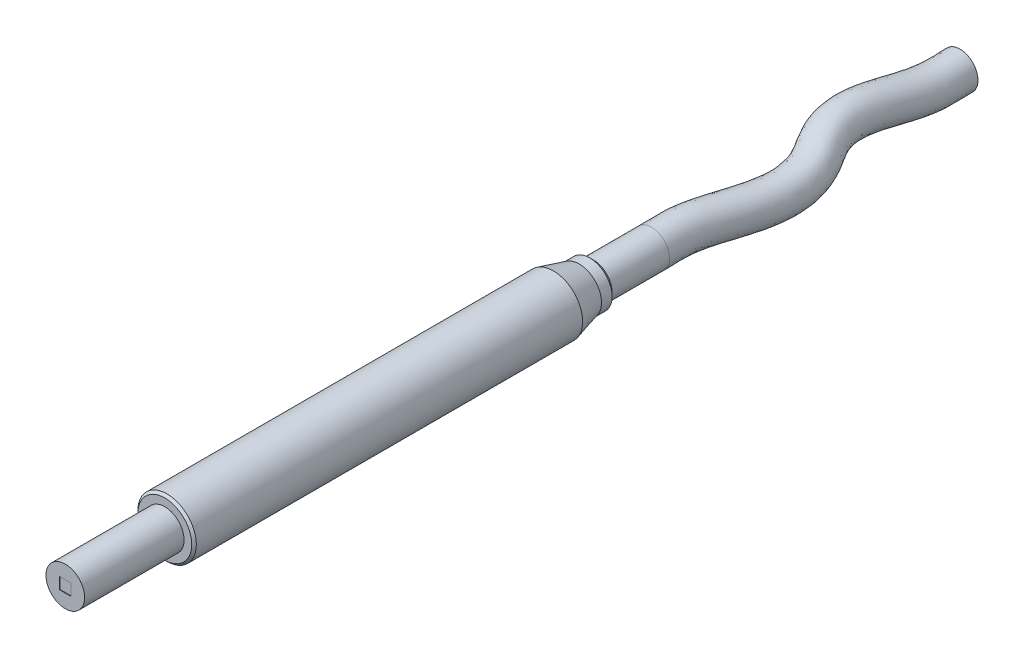
ISO-10303-21;
HEADER;
FILE_DESCRIPTION(('STEP AP214'),'2;1');
FILE_NAME('part.step','',(''),(''),'','','');
FILE_SCHEMA(('AUTOMOTIVE_DESIGN { 1 0 10303 214 1 1 1 1 }'));
ENDSEC;
DATA;
#1=APPLICATION_CONTEXT('core data for automotive mechanical design processes');
#2=APPLICATION_PROTOCOL_DEFINITION('international standard','automotive_design',2000,#1);
#3=PRODUCT_CONTEXT('',#1,'mechanical');
#4=PRODUCT('Part','Part','',(#3));
#5=PRODUCT_RELATED_PRODUCT_CATEGORY('part','',(#4));
#6=PRODUCT_DEFINITION_FORMATION('','',#4);
#7=PRODUCT_DEFINITION_CONTEXT('part definition',#1,'design');
#8=PRODUCT_DEFINITION('design','',#6,#7);
#9=PRODUCT_DEFINITION_SHAPE('','',#8);
#10=(LENGTH_UNIT() NAMED_UNIT(*) SI_UNIT(.MILLI.,.METRE.));
#11=(NAMED_UNIT(*) PLANE_ANGLE_UNIT() SI_UNIT($,.RADIAN.));
#12=(NAMED_UNIT(*) SI_UNIT($,.STERADIAN.) SOLID_ANGLE_UNIT());
#13=UNCERTAINTY_MEASURE_WITH_UNIT(LENGTH_MEASURE(1.E-05),#10,'distance_accuracy_value','');
#14=(GEOMETRIC_REPRESENTATION_CONTEXT(3) GLOBAL_UNCERTAINTY_ASSIGNED_CONTEXT((#13)) GLOBAL_UNIT_ASSIGNED_CONTEXT((#10,
#11,#12)) REPRESENTATION_CONTEXT('',''));
#15=CARTESIAN_POINT('',(0.,0.,0.));
#16=DIRECTION('',(0.,0.,1.));
#17=DIRECTION('',(1.,0.,0.));
#18=AXIS2_PLACEMENT_3D('',#15,#16,#17);
#19=CARTESIAN_POINT('',(0.,0.,-127.3));
#20=DIRECTION('',(0.,0.,1.));
#21=DIRECTION('',(1.,0.,0.));
#22=AXIS2_PLACEMENT_3D('',#19,#20,#21);
#23=CYLINDRICAL_SURFACE('',#22,4.85499999999988);
#24=CARTESIAN_POINT('',(0.,0.,-113.9));
#25=DIRECTION('',(0.,0.,-1.));
#26=DIRECTION('',(-1.,0.,0.));
#27=AXIS2_PLACEMENT_3D('',#24,#25,#26);
#28=CIRCLE('',#27,4.85499999999988);
#29=CARTESIAN_POINT('',(-4.85499999999988,0.,-113.9));
#30=VERTEX_POINT('',#29);
#31=EDGE_CURVE('E11',#30,#30,#28,.F.);
#32=ORIENTED_EDGE('',*,*,#31,.T.);
#33=EDGE_LOOP('',(#32));
#34=FACE_BOUND('',#33,.T.);
#35=CARTESIAN_POINT('',(0.,0.,-111.6));
#36=DIRECTION('',(0.,0.,-1.));
#37=DIRECTION('',(-1.,0.,0.));
#38=AXIS2_PLACEMENT_3D('',#35,#36,#37);
#39=CIRCLE('',#38,4.85499999999988);
#40=CARTESIAN_POINT('',(-4.85499999999988,0.,-111.6));
#41=VERTEX_POINT('',#40);
#42=EDGE_CURVE('E123',#41,#41,#39,.T.);
#43=ORIENTED_EDGE('',*,*,#42,.T.);
#44=EDGE_LOOP('',(#43));
#45=FACE_BOUND('',#44,.T.);
#46=ADVANCED_FACE('F34',(#34,#45),#23,.T.);
#47=CARTESIAN_POINT('',(0.,0.,-21.6));
#48=DIRECTION('',(0.,0.,1.));
#49=DIRECTION('',(1.,0.,0.));
#50=AXIS2_PLACEMENT_3D('',#47,#48,#49);
#51=CYLINDRICAL_SURFACE('',#50,4.2);
#52=CARTESIAN_POINT('',(0.,0.,-21.6));
#53=DIRECTION('',(0.,0.,1.));
#54=DIRECTION('',(1.,0.,0.));
#55=AXIS2_PLACEMENT_3D('',#52,#53,#54);
#56=CIRCLE('',#55,4.2);
#57=CARTESIAN_POINT('',(4.2,0.,-21.6));
#58=VERTEX_POINT('',#57);
#59=EDGE_CURVE('E112',#58,#58,#56,.T.);
#60=CARTESIAN_POINT('',(0.,0.,0.));
#61=DIRECTION('',(0.,0.,1.));
#62=DIRECTION('',(1.,0.,0.));
#63=AXIS2_PLACEMENT_3D('',#60,#61,#62);
#64=CIRCLE('',#63,4.2);
#65=CARTESIAN_POINT('',(4.2,0.,0.));
#66=VERTEX_POINT('',#65);
#67=EDGE_CURVE('E120',#66,#66,#64,.T.);
#68=CARTESIAN_POINT('',(4.2,0.,-21.6));
#69=CARTESIAN_POINT('',(4.2,0.,-21.375));
#70=CARTESIAN_POINT('',(4.2,0.,-21.15));
#71=CARTESIAN_POINT('',(4.2,0.,-20.7));
#72=CARTESIAN_POINT('',(4.2,0.,-20.475));
#73=CARTESIAN_POINT('',(4.2,0.,-20.025));
#74=CARTESIAN_POINT('',(4.2,0.,-19.8));
#75=CARTESIAN_POINT('',(4.2,0.,-19.35));
#76=CARTESIAN_POINT('',(4.2,0.,-19.125));
#77=CARTESIAN_POINT('',(4.2,0.,-18.675));
#78=CARTESIAN_POINT('',(4.2,0.,-18.45));
#79=CARTESIAN_POINT('',(4.2,0.,-18.));
#80=CARTESIAN_POINT('',(4.2,0.,-17.775));
#81=CARTESIAN_POINT('',(4.2,0.,-17.325));
#82=CARTESIAN_POINT('',(4.2,0.,-17.1));
#83=CARTESIAN_POINT('',(4.2,0.,-16.65));
#84=CARTESIAN_POINT('',(4.2,0.,-16.425));
#85=CARTESIAN_POINT('',(4.2,0.,-15.975));
#86=CARTESIAN_POINT('',(4.2,0.,-15.75));
#87=CARTESIAN_POINT('',(4.2,0.,-15.3));
#88=CARTESIAN_POINT('',(4.2,0.,-15.075));
#89=CARTESIAN_POINT('',(4.2,0.,-14.625));
#90=CARTESIAN_POINT('',(4.2,0.,-14.4));
#91=CARTESIAN_POINT('',(4.2,0.,-13.95));
#92=CARTESIAN_POINT('',(4.2,0.,-13.725));
#93=CARTESIAN_POINT('',(4.2,0.,-13.275));
#94=CARTESIAN_POINT('',(4.2,0.,-13.05));
#95=CARTESIAN_POINT('',(4.2,0.,-12.6));
#96=CARTESIAN_POINT('',(4.2,0.,-12.375));
#97=CARTESIAN_POINT('',(4.2,0.,-11.925));
#98=CARTESIAN_POINT('',(4.2,0.,-11.7));
#99=CARTESIAN_POINT('',(4.2,0.,-11.25));
#100=CARTESIAN_POINT('',(4.2,0.,-11.025));
#101=CARTESIAN_POINT('',(4.2,0.,-10.575));
#102=CARTESIAN_POINT('',(4.2,0.,-10.35));
#103=CARTESIAN_POINT('',(4.2,0.,-9.9));
#104=CARTESIAN_POINT('',(4.2,0.,-9.675));
#105=CARTESIAN_POINT('',(4.2,0.,-9.225));
#106=CARTESIAN_POINT('',(4.2,0.,-9.));
#107=CARTESIAN_POINT('',(4.2,0.,-8.55));
#108=CARTESIAN_POINT('',(4.2,0.,-8.325));
#109=CARTESIAN_POINT('',(4.2,0.,-7.875));
#110=CARTESIAN_POINT('',(4.2,0.,-7.65));
#111=CARTESIAN_POINT('',(4.2,0.,-7.2));
#112=CARTESIAN_POINT('',(4.2,0.,-6.975));
#113=CARTESIAN_POINT('',(4.2,0.,-6.525));
#114=CARTESIAN_POINT('',(4.2,0.,-6.3));
#115=CARTESIAN_POINT('',(4.2,0.,-5.85));
#116=CARTESIAN_POINT('',(4.2,0.,-5.625));
#117=CARTESIAN_POINT('',(4.2,0.,-5.17500000000001));
#118=CARTESIAN_POINT('',(4.2,0.,-4.95));
#119=CARTESIAN_POINT('',(4.2,0.,-4.5));
#120=CARTESIAN_POINT('',(4.2,0.,-4.275));
#121=CARTESIAN_POINT('',(4.2,0.,-3.825));
#122=CARTESIAN_POINT('',(4.2,0.,-3.6));
#123=CARTESIAN_POINT('',(4.2,0.,-3.15));
#124=CARTESIAN_POINT('',(4.2,0.,-2.925));
#125=CARTESIAN_POINT('',(4.2,0.,-2.475));
#126=CARTESIAN_POINT('',(4.2,0.,-2.25));
#127=CARTESIAN_POINT('',(4.2,0.,-1.8));
#128=CARTESIAN_POINT('',(4.2,0.,-1.575));
#129=CARTESIAN_POINT('',(4.2,0.,-1.125));
#130=CARTESIAN_POINT('',(4.2,0.,-0.900000000000003));
#131=CARTESIAN_POINT('',(4.2,0.,-0.450000000000002));
#132=CARTESIAN_POINT('',(4.2,0.,-0.225000000000003));
#133=CARTESIAN_POINT('',(4.2,0.,0.));
#134=B_SPLINE_CURVE_WITH_KNOTS('',3,(#68,#69,#70,#71,#72,#73,#74,#75,#76,#77,#78,#79,#80,#81,
#82,#83,#84,#85,#86,#87,#88,#89,#90,#91,#92,#93,#94,#95,#96,#97,#98,#99,#100,#101,#102,#103,
#104,#105,#106,#107,#108,#109,#110,#111,#112,#113,#114,#115,#116,#117,#118,#119,#120,#121,#122,
#123,#124,#125,#126,#127,#128,#129,#130,#131,#132,#133),.UNSPECIFIED.,.F.,.F.,(4,2,2,2,2,2,2,2,
2,2,2,2,2,2,2,2,2,2,2,2,2,2,2,2,2,2,2,2,2,2,2,2,4),(0.,0.675000000000002,1.35,2.025,2.7,3.375,
4.05,4.725,5.4,6.075,6.75,7.425,8.1,8.775,9.45,10.125,10.8,11.475,12.15,12.825,13.5,14.175,
14.85,15.525,16.2,16.875,17.55,18.225,18.9,19.575,20.25,20.925,21.6),.UNSPECIFIED.);
#135=EDGE_CURVE('BSEAM154',#58,#66,#134,.T.);
#136=ORIENTED_EDGE('',*,*,#59,.T.);
#137=ORIENTED_EDGE('',*,*,#67,.F.);
#138=ORIENTED_EDGE('',*,*,#135,.T.);
#139=ORIENTED_EDGE('',*,*,#135,.F.);
#140=EDGE_LOOP('',(#136,#138,#137,#139));
#141=FACE_BOUND('',#140,.T.);
#142=ADVANCED_FACE('F154',(#141),#51,.T.);
#143=CARTESIAN_POINT('',(0.,0.,0.));
#144=DIRECTION('',(0.,0.,1.));
#145=DIRECTION('',(1.,0.,0.));
#146=AXIS2_PLACEMENT_3D('',#143,#144,#145);
#147=PLANE('',#146);
#148=DIRECTION('',(1.,0.,0.));
#149=VECTOR('',#148,1.);
#150=CARTESIAN_POINT('',(-1.25,-1.25,0.));
#151=LINE('',#150,#149);
#152=CARTESIAN_POINT('',(-1.25,-1.25,0.));
#153=VERTEX_POINT('',#152);
#154=CARTESIAN_POINT('',(1.25,-1.25,0.));
#155=VERTEX_POINT('',#154);
#156=EDGE_CURVE('E50',#153,#155,#151,.T.);
#157=ORIENTED_EDGE('',*,*,#156,.F.);
#158=DIRECTION('',(0.,-1.,0.));
#159=VECTOR('',#158,1.);
#160=CARTESIAN_POINT('',(-1.25,-1.25,0.));
#161=LINE('',#160,#159);
#162=CARTESIAN_POINT('',(-1.25,1.25,0.));
#163=VERTEX_POINT('',#162);
#164=EDGE_CURVE('E94',#163,#153,#161,.T.);
#165=ORIENTED_EDGE('',*,*,#164,.F.);
#166=DIRECTION('',(-1.,0.,0.));
#167=VECTOR('',#166,1.);
#168=CARTESIAN_POINT('',(-1.25,1.25,0.));
#169=LINE('',#168,#167);
#170=CARTESIAN_POINT('',(1.25,1.25,0.));
#171=VERTEX_POINT('',#170);
#172=EDGE_CURVE('E107',#171,#163,#169,.T.);
#173=ORIENTED_EDGE('',*,*,#172,.F.);
#174=DIRECTION('',(0.,1.,0.));
#175=VECTOR('',#174,1.);
#176=CARTESIAN_POINT('',(1.25,-1.25,0.));
#177=LINE('',#176,#175);
#178=EDGE_CURVE('E104',#155,#171,#177,.T.);
#179=ORIENTED_EDGE('',*,*,#178,.F.);
#180=EDGE_LOOP('',(#157,#165,#173,#179));
#181=FACE_BOUND('',#180,.T.);
#182=ORIENTED_EDGE('',*,*,#67,.T.);
#183=EDGE_LOOP('',(#182));
#184=FACE_BOUND('',#183,.T.);
#185=ADVANCED_FACE('F160',(#181,#184),#147,.T.);
#186=CARTESIAN_POINT('',(0.,0.,-111.6));
#187=DIRECTION('',(0.,0.,1.));
#188=DIRECTION('',(1.,0.,0.));
#189=AXIS2_PLACEMENT_3D('',#186,#187,#188);
#190=CYLINDRICAL_SURFACE('',#189,6.355);
#191=CARTESIAN_POINT('',(0.,0.,-22.1000000000001));
#192=DIRECTION('',(0.,0.,-1.));
#193=DIRECTION('',(-1.,0.,0.));
#194=AXIS2_PLACEMENT_3D('',#191,#192,#193);
#195=CIRCLE('',#194,6.355);
#196=CARTESIAN_POINT('',(6.355,0.,-22.1000000000001));
#197=VERTEX_POINT('',#196);
#198=EDGE_CURVE('E129',#197,#197,#195,.T.);
#199=CARTESIAN_POINT('',(0.,0.,-106.001923788646));
#200=DIRECTION('',(0.,0.,-1.));
#201=DIRECTION('',(-1.,0.,0.));
#202=AXIS2_PLACEMENT_3D('',#199,#200,#201);
#203=CIRCLE('',#202,6.355);
#204=CARTESIAN_POINT('',(6.355,0.,-106.001923788646));
#205=VERTEX_POINT('',#204);
#206=EDGE_CURVE('E126',#205,#205,#203,.F.);
#207=CARTESIAN_POINT('',(6.355,0.,-22.1000000000001));
#208=CARTESIAN_POINT('',(6.355,0.,-22.9739783727985));
#209=CARTESIAN_POINT('',(6.355,0.,-23.8479567455969));
#210=CARTESIAN_POINT('',(6.355,0.,-25.5959134911937));
#211=CARTESIAN_POINT('',(6.355,0.,-26.4698918639921));
#212=CARTESIAN_POINT('',(6.355,0.,-28.2178486095889));
#213=CARTESIAN_POINT('',(6.355,0.,-29.0918269823873));
#214=CARTESIAN_POINT('',(6.355,0.,-30.8397837279841));
#215=CARTESIAN_POINT('',(6.355,0.,-31.7137621007825));
#216=CARTESIAN_POINT('',(6.355,0.,-33.4617188463793));
#217=CARTESIAN_POINT('',(6.355,0.,-34.3356972191777));
#218=CARTESIAN_POINT('',(6.355,0.,-36.0836539647745));
#219=CARTESIAN_POINT('',(6.355,0.,-36.9576323375729));
#220=CARTESIAN_POINT('',(6.355,0.,-38.7055890831696));
#221=CARTESIAN_POINT('',(6.355,0.,-39.579567455968));
#222=CARTESIAN_POINT('',(6.355,0.,-41.3275242015648));
#223=CARTESIAN_POINT('',(6.355,0.,-42.2015025743632));
#224=CARTESIAN_POINT('',(6.355,0.,-43.94945931996));
#225=CARTESIAN_POINT('',(6.355,0.,-44.8234376927584));
#226=CARTESIAN_POINT('',(6.355,0.,-46.5713944383552));
#227=CARTESIAN_POINT('',(6.355,0.,-47.4453728111536));
#228=CARTESIAN_POINT('',(6.355,0.,-49.1933295567504));
#229=CARTESIAN_POINT('',(6.355,0.,-50.0673079295488));
#230=CARTESIAN_POINT('',(6.355,0.,-51.8152646751456));
#231=CARTESIAN_POINT('',(6.355,0.,-52.689243047944));
#232=CARTESIAN_POINT('',(6.355,0.,-54.4371997935408));
#233=CARTESIAN_POINT('',(6.355,0.,-55.3111781663392));
#234=CARTESIAN_POINT('',(6.355,0.,-57.059134911936));
#235=CARTESIAN_POINT('',(6.355,0.,-57.9331132847344));
#236=CARTESIAN_POINT('',(6.355,0.,-59.6810700303312));
#237=CARTESIAN_POINT('',(6.355,0.,-60.5550484031296));
#238=CARTESIAN_POINT('',(6.355,0.,-62.3030051487263));
#239=CARTESIAN_POINT('',(6.355,0.,-63.1769835215247));
#240=CARTESIAN_POINT('',(6.355,0.,-64.9249402671215));
#241=CARTESIAN_POINT('',(6.355,0.,-65.7989186399199));
#242=CARTESIAN_POINT('',(6.355,0.,-67.5468753855167));
#243=CARTESIAN_POINT('',(6.355,0.,-68.4208537583151));
#244=CARTESIAN_POINT('',(6.355,0.,-70.1688105039119));
#245=CARTESIAN_POINT('',(6.355,0.,-71.0427888767103));
#246=CARTESIAN_POINT('',(6.355,0.,-72.7907456223071));
#247=CARTESIAN_POINT('',(6.355,0.,-73.6647239951055));
#248=CARTESIAN_POINT('',(6.355,0.,-75.4126807407023));
#249=CARTESIAN_POINT('',(6.355,0.,-76.2866591135007));
#250=CARTESIAN_POINT('',(6.355,0.,-78.0346158590975));
#251=CARTESIAN_POINT('',(6.355,0.,-78.9085942318959));
#252=CARTESIAN_POINT('',(6.355,0.,-80.6565509774927));
#253=CARTESIAN_POINT('',(6.355,0.,-81.5305293502911));
#254=CARTESIAN_POINT('',(6.355,0.,-83.2784860958879));
#255=CARTESIAN_POINT('',(6.355,0.,-84.1524644686862));
#256=CARTESIAN_POINT('',(6.355,0.,-85.9004212142831));
#257=CARTESIAN_POINT('',(6.355,0.,-86.7743995870814));
#258=CARTESIAN_POINT('',(6.355,0.,-88.5223563326782));
#259=CARTESIAN_POINT('',(6.355,0.,-89.3963347054766));
#260=CARTESIAN_POINT('',(6.355,0.,-91.1442914510734));
#261=CARTESIAN_POINT('',(6.355,0.,-92.0182698238718));
#262=CARTESIAN_POINT('',(6.355,0.,-93.7662265694686));
#263=CARTESIAN_POINT('',(6.355,0.,-94.640204942267));
#264=CARTESIAN_POINT('',(6.355,0.,-96.3881616878638));
#265=CARTESIAN_POINT('',(6.355,0.,-97.2621400606622));
#266=CARTESIAN_POINT('',(6.355,0.,-99.010096806259));
#267=CARTESIAN_POINT('',(6.355,0.,-99.8840751790574));
#268=CARTESIAN_POINT('',(6.355,0.,-101.632031924654));
#269=CARTESIAN_POINT('',(6.355,0.,-102.506010297453));
#270=CARTESIAN_POINT('',(6.355,0.,-104.253967043049));
#271=CARTESIAN_POINT('',(6.355,0.,-105.127945415848));
#272=CARTESIAN_POINT('',(6.355,0.,-106.001923788646));
#273=B_SPLINE_CURVE_WITH_KNOTS('',3,(#207,#208,#209,#210,#211,#212,#213,#214,#215,#216,#217,
#218,#219,#220,#221,#222,#223,#224,#225,#226,#227,#228,#229,#230,#231,#232,#233,#234,#235,#236,
#237,#238,#239,#240,#241,#242,#243,#244,#245,#246,#247,#248,#249,#250,#251,#252,#253,#254,#255,
#256,#257,#258,#259,#260,#261,#262,#263,#264,#265,#266,#267,#268,#269,#270,#271,#272),
.UNSPECIFIED.,.F.,.F.,(4,2,2,2,2,2,2,2,2,2,2,2,2,2,2,2,2,2,2,2,2,2,2,2,2,2,2,2,2,2,2,2,4),(0.,
2.62193511839519,5.24387023679038,7.86580535518557,10.4877404735808,13.109675591976,
15.7316107103711,18.3535458287663,20.9754809471615,23.5974160655567,26.2193511839519,
28.8412863023471,31.4632214207423,34.0851565391375,36.7070916575327,39.3290267759278,
41.950961894323,44.5728970127182,47.1948321311134,49.8167672495086,52.4387023679038,
55.060637486299,57.6825726046942,60.3045077230894,62.9264428414846,65.5483779598797,
68.1703130782749,70.7922481966701,73.4141833150653,76.0361184334605,78.6580535518557,
81.2799886702509,83.9019237886461),.UNSPECIFIED.);
#274=EDGE_CURVE('BSEAM171',#197,#205,#273,.T.);
#275=ORIENTED_EDGE('',*,*,#198,.T.);
#276=ORIENTED_EDGE('',*,*,#206,.T.);
#277=ORIENTED_EDGE('',*,*,#274,.T.);
#278=ORIENTED_EDGE('',*,*,#274,.F.);
#279=EDGE_LOOP('',(#275,#277,#276,#278));
#280=FACE_BOUND('',#279,.T.);
#281=ADVANCED_FACE('F171',(#280),#190,.T.);
#282=CARTESIAN_POINT('',(0.,0.,-21.6));
#283=DIRECTION('',(0.,0.,-1.));
#284=DIRECTION('',(-1.,0.,0.));
#285=AXIS2_PLACEMENT_3D('',#282,#283,#284);
#286=PLANE('',#285);
#287=CARTESIAN_POINT('',(0.,0.,-21.6));
#288=DIRECTION('',(0.,0.,-1.));
#289=DIRECTION('',(-1.,0.,0.));
#290=AXIS2_PLACEMENT_3D('',#287,#288,#289);
#291=CIRCLE('',#290,5.85499999999985);
#292=CARTESIAN_POINT('',(-5.85499999999985,0.,-21.6));
#293=VERTEX_POINT('',#292);
#294=EDGE_CURVE('E132',#293,#293,#291,.F.);
#295=ORIENTED_EDGE('',*,*,#294,.T.);
#296=EDGE_LOOP('',(#295));
#297=FACE_BOUND('',#296,.T.);
#298=ORIENTED_EDGE('',*,*,#59,.F.);
#299=EDGE_LOOP('',(#298));
#300=FACE_BOUND('',#299,.T.);
#301=ADVANCED_FACE('F167',(#297,#300),#286,.F.);
#302=CARTESIAN_POINT('',(0.,0.,-111.6));
#303=DIRECTION('',(0.,0.,1.));
#304=DIRECTION('',(1.,0.,0.));
#305=AXIS2_PLACEMENT_3D('',#302,#303,#304);
#306=CONICAL_SURFACE('',#305,4.85499999999988,0.261799387799147);
#307=ORIENTED_EDGE('',*,*,#206,.F.);
#308=EDGE_LOOP('',(#307));
#309=FACE_BOUND('',#308,.T.);
#310=ORIENTED_EDGE('',*,*,#42,.F.);
#311=EDGE_LOOP('',(#310));
#312=FACE_BOUND('',#311,.T.);
#313=ADVANCED_FACE('F170',(#309,#312),#306,.T.);
#314=CARTESIAN_POINT('',(-1.25,-1.25,-0.1));
#315=DIRECTION('',(0.,-1.,0.));
#316=DIRECTION('',(1.,0.,0.));
#317=AXIS2_PLACEMENT_3D('',#314,#315,#316);
#318=PLANE('',#317);
#319=ORIENTED_EDGE('',*,*,#156,.T.);
#320=DIRECTION('',(0.,0.,1.));
#321=VECTOR('',#320,1.);
#322=CARTESIAN_POINT('',(1.25,-1.25,-0.1));
#323=LINE('',#322,#321);
#324=CARTESIAN_POINT('',(1.25,-1.25,-0.1));
#325=VERTEX_POINT('',#324);
#326=EDGE_CURVE('E74',#325,#155,#323,.T.);
#327=ORIENTED_EDGE('',*,*,#326,.F.);
#328=DIRECTION('',(1.,0.,0.));
#329=VECTOR('',#328,1.);
#330=CARTESIAN_POINT('',(-1.25,-1.25,-0.1));
#331=LINE('',#330,#329);
#332=CARTESIAN_POINT('',(-1.25,-1.25,-0.1));
#333=VERTEX_POINT('',#332);
#334=EDGE_CURVE('E90',#333,#325,#331,.T.);
#335=ORIENTED_EDGE('',*,*,#334,.F.);
#336=DIRECTION('',(0.,0.,1.));
#337=VECTOR('',#336,1.);
#338=CARTESIAN_POINT('',(-1.25,-1.25,-0.1));
#339=LINE('',#338,#337);
#340=EDGE_CURVE('E58',#333,#153,#339,.T.);
#341=ORIENTED_EDGE('',*,*,#340,.T.);
#342=EDGE_LOOP('',(#319,#327,#335,#341));
#343=FACE_BOUND('',#342,.T.);
#344=ADVANCED_FACE('F180',(#343),#318,.F.);
#345=CARTESIAN_POINT('',(-1.25,-1.25,-0.1));
#346=DIRECTION('',(-1.,0.,0.));
#347=DIRECTION('',(0.,0.,1.));
#348=AXIS2_PLACEMENT_3D('',#345,#346,#347);
#349=PLANE('',#348);
#350=ORIENTED_EDGE('',*,*,#164,.T.);
#351=ORIENTED_EDGE('',*,*,#340,.F.);
#352=DIRECTION('',(0.,-1.,0.));
#353=VECTOR('',#352,1.);
#354=CARTESIAN_POINT('',(-1.25,-1.25,-0.1));
#355=LINE('',#354,#353);
#356=CARTESIAN_POINT('',(-1.25,1.25,-0.1));
#357=VERTEX_POINT('',#356);
#358=EDGE_CURVE('E100',#357,#333,#355,.T.);
#359=ORIENTED_EDGE('',*,*,#358,.F.);
#360=DIRECTION('',(0.,0.,1.));
#361=VECTOR('',#360,1.);
#362=CARTESIAN_POINT('',(-1.25,1.25,-0.1));
#363=LINE('',#362,#361);
#364=EDGE_CURVE('E113',#357,#163,#363,.T.);
#365=ORIENTED_EDGE('',*,*,#364,.T.);
#366=EDGE_LOOP('',(#350,#351,#359,#365));
#367=FACE_BOUND('',#366,.T.);
#368=ADVANCED_FACE('F213',(#367),#349,.F.);
#369=CARTESIAN_POINT('',(-1.25,1.25,-0.1));
#370=DIRECTION('',(0.,1.,0.));
#371=DIRECTION('',(-1.,0.,0.));
#372=AXIS2_PLACEMENT_3D('',#369,#370,#371);
#373=PLANE('',#372);
#374=ORIENTED_EDGE('',*,*,#172,.T.);
#375=ORIENTED_EDGE('',*,*,#364,.F.);
#376=DIRECTION('',(-1.,0.,0.));
#377=VECTOR('',#376,1.);
#378=CARTESIAN_POINT('',(-1.25,1.25,-0.1));
#379=LINE('',#378,#377);
#380=CARTESIAN_POINT('',(1.25,1.25,-0.1));
#381=VERTEX_POINT('',#380);
#382=EDGE_CURVE('E97',#381,#357,#379,.T.);
#383=ORIENTED_EDGE('',*,*,#382,.F.);
#384=DIRECTION('',(0.,0.,1.));
#385=VECTOR('',#384,1.);
#386=CARTESIAN_POINT('',(1.25,1.25,-0.1));
#387=LINE('',#386,#385);
#388=EDGE_CURVE('E115',#381,#171,#387,.T.);
#389=ORIENTED_EDGE('',*,*,#388,.T.);
#390=EDGE_LOOP('',(#374,#375,#383,#389));
#391=FACE_BOUND('',#390,.T.);
#392=ADVANCED_FACE('F209',(#391),#373,.F.);
#393=CARTESIAN_POINT('',(1.25,-1.25,-0.1));
#394=DIRECTION('',(1.,0.,0.));
#395=DIRECTION('',(0.,1.,0.));
#396=AXIS2_PLACEMENT_3D('',#393,#394,#395);
#397=PLANE('',#396);
#398=ORIENTED_EDGE('',*,*,#178,.T.);
#399=ORIENTED_EDGE('',*,*,#388,.F.);
#400=DIRECTION('',(0.,1.,0.));
#401=VECTOR('',#400,1.);
#402=CARTESIAN_POINT('',(1.25,-1.25,-0.1));
#403=LINE('',#402,#401);
#404=EDGE_CURVE('E93',#325,#381,#403,.T.);
#405=ORIENTED_EDGE('',*,*,#404,.F.);
#406=ORIENTED_EDGE('',*,*,#326,.T.);
#407=EDGE_LOOP('',(#398,#399,#405,#406));
#408=FACE_BOUND('',#407,.T.);
#409=ADVANCED_FACE('F191',(#408),#397,.F.);
#410=CARTESIAN_POINT('',(0.,0.,-0.1));
#411=DIRECTION('',(0.,0.,1.));
#412=DIRECTION('',(1.,0.,0.));
#413=AXIS2_PLACEMENT_3D('',#410,#411,#412);
#414=PLANE('',#413);
#415=ORIENTED_EDGE('',*,*,#334,.T.);
#416=ORIENTED_EDGE('',*,*,#404,.T.);
#417=ORIENTED_EDGE('',*,*,#382,.T.);
#418=ORIENTED_EDGE('',*,*,#358,.T.);
#419=EDGE_LOOP('',(#415,#416,#417,#418));
#420=FACE_BOUND('',#419,.T.);
#421=ADVANCED_FACE('F184',(#420),#414,.T.);
#422=CARTESIAN_POINT('',(0.,0.,-22.1000000000001));
#423=DIRECTION('',(0.,0.,-1.));
#424=DIRECTION('',(-1.,0.,0.));
#425=AXIS2_PLACEMENT_3D('',#422,#423,#424);
#426=CONICAL_SURFACE('',#425,6.355,0.785398163397478);
#427=ORIENTED_EDGE('',*,*,#294,.F.);
#428=EDGE_LOOP('',(#427));
#429=FACE_BOUND('',#428,.T.);
#430=ORIENTED_EDGE('',*,*,#198,.F.);
#431=EDGE_LOOP('',(#430));
#432=FACE_BOUND('',#431,.T.);
#433=ADVANCED_FACE('F182',(#429,#432),#426,.T.);
#434=CARTESIAN_POINT('',(0.,0.,-114.7));
#435=DIRECTION('',(0.,0.,-1.));
#436=DIRECTION('',(-1.,0.,0.));
#437=AXIS2_PLACEMENT_3D('',#434,#435,#436);
#438=PLANE('',#437);
#439=CARTESIAN_POINT('',(0.,0.,-114.7));
#440=DIRECTION('',(0.,0.,-1.));
#441=DIRECTION('',(-1.,0.,0.));
#442=AXIS2_PLACEMENT_3D('',#439,#440,#441);
#443=CIRCLE('',#442,4.05499999999989);
#444=CARTESIAN_POINT('',(-4.05499999999989,0.,-114.7));
#445=VERTEX_POINT('',#444);
#446=EDGE_CURVE('E43',#445,#445,#443,.T.);
#447=ORIENTED_EDGE('',*,*,#446,.T.);
#448=EDGE_LOOP('',(#447));
#449=FACE_BOUND('',#448,.T.);
#450=CARTESIAN_POINT('',(0.,0.,-114.7));
#451=DIRECTION('',(0.,0.,-1.));
#452=DIRECTION('',(-1.,0.,0.));
#453=AXIS2_PLACEMENT_3D('',#450,#451,#452);
#454=CIRCLE('',#453,3.925);
#455=CARTESIAN_POINT('',(-3.925,0.,-114.7));
#456=VERTEX_POINT('',#455);
#457=EDGE_CURVE('E86',#456,#456,#454,.T.);
#458=ORIENTED_EDGE('',*,*,#457,.F.);
#459=EDGE_LOOP('',(#458));
#460=FACE_BOUND('',#459,.T.);
#461=ADVANCED_FACE('F138',(#449,#460),#438,.T.);
#462=CARTESIAN_POINT('',(0.,0.,-114.7));
#463=DIRECTION('',(0.,0.,-1.));
#464=DIRECTION('',(-1.,0.,0.));
#465=AXIS2_PLACEMENT_3D('',#462,#463,#464);
#466=CYLINDRICAL_SURFACE('',#465,3.925);
#467=ORIENTED_EDGE('',*,*,#457,.T.);
#468=EDGE_LOOP('',(#467));
#469=FACE_BOUND('',#468,.T.);
#470=CARTESIAN_POINT('',(0.,0.,-127.3));
#471=DIRECTION('',(0.,0.,-1.));
#472=DIRECTION('',(-1.,0.,0.));
#473=AXIS2_PLACEMENT_3D('',#470,#471,#472);
#474=CIRCLE('',#473,3.925);
#475=CARTESIAN_POINT('',(-3.925,0.,-127.3));
#476=VERTEX_POINT('',#475);
#477=EDGE_CURVE('E38',#476,#476,#474,.T.);
#478=ORIENTED_EDGE('',*,*,#477,.F.);
#479=EDGE_LOOP('',(#478));
#480=FACE_BOUND('',#479,.T.);
#481=ADVANCED_FACE('F143',(#469,#480),#466,.T.);
#482=CARTESIAN_POINT('',(0.,0.,-114.7));
#483=DIRECTION('',(0.,0.,1.));
#484=DIRECTION('',(1.,0.,0.));
#485=AXIS2_PLACEMENT_3D('',#482,#483,#484);
#486=CONICAL_SURFACE('',#485,4.05499999999989,0.785398163397437);
#487=ORIENTED_EDGE('',*,*,#31,.F.);
#488=EDGE_LOOP('',(#487));
#489=FACE_BOUND('',#488,.T.);
#490=ORIENTED_EDGE('',*,*,#446,.F.);
#491=EDGE_LOOP('',(#490));
#492=FACE_BOUND('',#491,.T.);
#493=ADVANCED_FACE('F36',(#489,#492),#486,.T.);
#494=CARTESIAN_POINT('',(-3.925,0.,-127.3));
#495=CARTESIAN_POINT('',(-3.92500000342893,2.25716405888657E-09,-128.407525819856));
#496=CARTESIAN_POINT('',(-3.94595316007452,0.0137979293877392,-129.416337660994));
#497=CARTESIAN_POINT('',(-3.96827810765852,0.0284991987544241,-131.43382527489));
#498=CARTESIAN_POINT('',(-3.96968192046765,0.0294236228345963,-132.44524521326));
#499=CARTESIAN_POINT('',(-3.80620442967361,-0.0782284218678075,-136.043687123356));
#500=CARTESIAN_POINT('',(-3.43567856062581,-0.321923742718777,-138.564045366827));
#501=CARTESIAN_POINT('',(-2.60730538529982,-0.839437883436161,-143.554654340785));
#502=CARTESIAN_POINT('',(-2.14688703527552,-1.11482910655479,-146.021199393903));
#503=CARTESIAN_POINT('',(-1.48001024120567,-1.44958652847878,-150.736117976726));
#504=CARTESIAN_POINT('',(-1.2772376050723,-1.50618172303795,-152.97770305642));
#505=CARTESIAN_POINT('',(-1.359830907101,-1.29295216364322,-156.004349896355));
#506=CARTESIAN_POINT('',(-1.45035912430221,-1.17334979588721,-156.956904634525));
#507=CARTESIAN_POINT('',(-1.77649679823351,-0.823675099910176,-158.747467375594));
#508=CARTESIAN_POINT('',(-2.01055497978822,-0.594872528577109,-159.584749057267));
#509=CARTESIAN_POINT('',(-2.49188379406523,-0.151851727539346,-160.773195112329));
#510=CARTESIAN_POINT('',(-2.69681702889767,0.0336912928798771,-161.212443665542));
#511=CARTESIAN_POINT('',(-3.15771577109733,0.441966908415023,-162.191209233762));
#512=CARTESIAN_POINT('',(-3.41401872381308,0.665299752453578,-162.731021006958));
#513=CARTESIAN_POINT('',(-4.08129614427253,1.22848753655306,-164.380420527656));
#514=CARTESIAN_POINT('',(-4.39995604897756,1.4771400737592,-165.450331288644));
#515=CARTESIAN_POINT('',(-4.86729813424568,1.80173793468544,-167.6085733446));
#516=CARTESIAN_POINT('',(-5.01657457260375,1.87832981729669,-168.696409401443));
#517=CARTESIAN_POINT('',(-5.27716135963823,1.92436602999528,-171.943674858421));
#518=CARTESIAN_POINT('',(-5.2059176236635,1.71487051174411,-174.087834912416));
#519=CARTESIAN_POINT('',(-4.88365044284664,1.14851095268616,-178.295174533126));
#520=CARTESIAN_POINT('',(-4.63086196083273,0.789625763656157,-180.364210130185));
#521=CARTESIAN_POINT('',(-4.18190316393572,0.180844977378598,-184.37466756672));
#522=CARTESIAN_POINT('',(-3.98620570542633,-0.0683196643427661,-186.315082627373));
#523=CARTESIAN_POINT('',(-3.84770125297496,-0.244920670113831,-190.10211511357));
#524=CARTESIAN_POINT('',(-3.92214553299434,-0.150000004443797,-192.152052839862));
#525=CARTESIAN_POINT('',(-3.92214554177641,-0.149999993243151,-194.297906214084));
#526=CARTESIAN_POINT('',(-3.925,7.85,-127.3));
#527=CARTESIAN_POINT('',(-3.92500000322142,7.85000000212017,-128.34357444563));
#528=CARTESIAN_POINT('',(-3.94524254088446,7.86332997737667,-129.323519657552));
#529=CARTESIAN_POINT('',(-3.96835582553158,7.8785503769877,-131.412248687734));
#530=CARTESIAN_POINT('',(-3.97129731478665,7.8804873741693,-132.527022289052));
#531=CARTESIAN_POINT('',(-3.78454111176229,7.75750601680825,-136.63787119626));
#532=CARTESIAN_POINT('',(-3.37953308213084,7.49153504330221,-139.319805543963));
#533=CARTESIAN_POINT('',(-2.53672178544159,6.96500096439254,-144.397397601022));
#534=CARTESIAN_POINT('',(-2.09275403126312,6.7006940050457,-146.784573025077));
#535=CARTESIAN_POINT('',(-1.4855223029741,6.39587712742981,-151.077791616885));
#536=CARTESIAN_POINT('',(-1.33163742279678,6.36239640337832,-152.966653347017));
#537=CARTESIAN_POINT('',(-1.39205762908494,6.51838225756732,-155.180765326543));
#538=CARTESIAN_POINT('',(-1.45678103026915,6.60157694027725,-155.814298906533));
#539=CARTESIAN_POINT('',(-1.65475633126985,6.81385888594769,-156.901301429201));
#540=CARTESIAN_POINT('',(-1.78408716339587,6.93973088873683,-157.352816845924));
#541=CARTESIAN_POINT('',(-2.04137140183015,7.17653908462391,-157.988077045081));
#542=CARTESIAN_POINT('',(-2.21040731305934,7.33074590336079,-158.359384224066));
#543=CARTESIAN_POINT('',(-2.69712141683248,7.76188794953841,-159.392967401053));
#544=CARTESIAN_POINT('',(-3.01542535332213,8.04022570360709,-160.056537127788));
#545=CARTESIAN_POINT('',(-3.95217824831364,8.83085333132633,-162.372036608658));
#546=CARTESIAN_POINT('',(-4.39694251234474,9.17749748350839,-163.87136624895));
#547=CARTESIAN_POINT('',(-5.03495748211189,9.62064820553285,-166.817892331645));
#548=CARTESIAN_POINT('',(-5.23025075224077,9.71935349120254,-168.263694687779));
#549=CARTESIAN_POINT('',(-5.56363807498814,9.77825092390785,-172.418154717155));
#550=CARTESIAN_POINT('',(-5.46388113335108,9.51626356039968,-174.946734641703));
#551=CARTESIAN_POINT('',(-5.11004389923667,8.89442231810729,-179.566233438519));
#552=CARTESIAN_POINT('',(-4.84934639900549,8.52704333086166,-181.675416278305));
#553=CARTESIAN_POINT('',(-4.42450007769774,7.95112652603656,-185.469427361572));
#554=CARTESIAN_POINT('',(-4.2625604473945,7.7457643201643,-187.150495644566));
#555=CARTESIAN_POINT('',(-4.15901678030951,7.61374039009624,-189.981617293629));
#556=CARTESIAN_POINT('',(-4.22217016146412,7.69426447245325,-191.892274366274));
#557=CARTESIAN_POINT('',(-4.22217017213415,7.69426448605499,-194.297906201155));
#558=CARTESIAN_POINT('',(3.925,7.85,-127.3));
#559=CARTESIAN_POINT('',(3.92499999646732,7.85000000232538,-128.440689262138));
#560=CARTESIAN_POINT('',(3.90367833215059,7.86404059656779,-129.464470551615));
#561=CARTESIAN_POINT('',(3.88176219471708,7.87847265911349,-131.445014305842));
#562=CARTESIAN_POINT('',(3.88115486606112,7.87887259156606,-132.402818115147));
#563=CARTESIAN_POINT('',(4.03256371352431,7.77916789399759,-135.735605906639));
#564=CARTESIAN_POINT('',(4.3832480885545,7.54836817958384,-138.149095950986));
#565=CARTESIAN_POINT('',(5.19027788291894,7.0441879665171,-143.01111910637));
#566=CARTESIAN_POINT('',(5.647556981972,6.77027102703716,-145.457946089406));
#567=CARTESIAN_POINT('',(6.32013214162145,6.43265311724912,-150.213152475418));
#568=CARTESIAN_POINT('',(6.53334679756316,6.37049523379759,-152.517661048033));
#569=CARTESIAN_POINT('',(6.44594006131015,6.59615160660786,-155.720698544837));
#570=CARTESIAN_POINT('',(6.34976241157918,6.72387256452928,-156.746119386469));
#571=CARTESIAN_POINT('',(5.99326667867849,7.10609693944011,-158.703441010607));
#572=CARTESIAN_POINT('',(5.73394346326039,7.35978171812245,-159.634787674739));
#573=CARTESIAN_POINT('',(5.19660594851833,7.85435353178783,-160.961526297994));
#574=CARTESIAN_POINT('',(4.97484475544155,8.05501165222426,-161.436737569585));
#575=CARTESIAN_POINT('',(4.48539505597661,8.48857860690448,-162.476129671175));
#576=CARTESIAN_POINT('',(4.21766207013689,8.7217858913014,-163.040916244977));
#577=CARTESIAN_POINT('',(3.52775161062927,9.30407609713043,-164.746262060811));
#578=CARTESIAN_POINT('',(3.19935808873588,9.56023559419031,-165.850128667923));
#579=CARTESIAN_POINT('',(2.71985101547897,9.89327756472567,-168.064644277873));
#580=CARTESIAN_POINT('',(2.56794637597073,9.97100288949991,-169.174867183408));
#581=CARTESIAN_POINT('',(2.30366319754507,10.0176920539169,-172.4681957774));
#582=CARTESIAN_POINT('',(2.37710488458886,9.80587820964647,-174.615794060913));
#583=CARTESIAN_POINT('',(2.69643360791653,9.24468287753454,-178.784768990462));
#584=CARTESIAN_POINT('',(2.94472304421911,8.89260039238018,-180.81326052753));
#585=CARTESIAN_POINT('',(3.37932119151045,8.30334675254733,-184.694328981862));
#586=CARTESIAN_POINT('',(3.56455736437779,8.06765195643572,-186.545335709844));
#587=CARTESIAN_POINT('',(3.69342840943591,7.9033341166925,-190.068966471354));
#588=CARTESIAN_POINT('',(3.62209431662788,7.99428910435294,-192.080433028919));
#589=CARTESIAN_POINT('',(3.62209430716399,7.99428911641272,-194.297906204047));
#590=CARTESIAN_POINT('',(3.925,0.,-127.3));
#591=CARTESIAN_POINT('',(3.92499999625981,2.46237952343347E-09,-128.504640636364));
#592=CARTESIAN_POINT('',(3.90296771296054,0.014508548578862,-129.557288555057));
#593=CARTESIAN_POINT('',(3.88183991259014,0.0284214808802136,-131.466590892998));
#594=CARTESIAN_POINT('',(3.88277026038012,0.0278088402313567,-132.321041039354));
#595=CARTESIAN_POINT('',(4.01090039561299,-0.0565665446784655,-135.141421833735));
#596=CARTESIAN_POINT('',(4.32710261006167,-0.265090606436602,-137.39333577385));
#597=CARTESIAN_POINT('',(5.11969428305857,-0.760250881312137,-142.168375846133));
#598=CARTESIAN_POINT('',(5.59342397795959,-1.04525208456116,-144.694572458232));
#599=CARTESIAN_POINT('',(6.32564420338988,-1.41281053866165,-149.871478835259));
#600=CARTESIAN_POINT('',(6.58774661528662,-1.49808289261765,-152.528710757437));
#601=CARTESIAN_POINT('',(6.47816678329461,-1.21518281460319,-156.54428311465));
#602=CARTESIAN_POINT('',(6.35618431754613,-1.05105417163316,-157.888725114469));
#603=CARTESIAN_POINT('',(5.87152621171483,-0.531437046419785,-160.549606956992));
#604=CARTESIAN_POINT('',(5.50747564686596,-0.17482169919149,-161.866719886081));
#605=CARTESIAN_POINT('',(4.74609355628425,0.525962719624569,-163.746644365243));
#606=CARTESIAN_POINT('',(4.48843503960322,0.757957041743337,-164.289797011062));
#607=CARTESIAN_POINT('',(4.02480070171176,1.16865756578109,-165.274371503884));
#608=CARTESIAN_POINT('',(3.81906869964692,1.3468599401469,-165.715400124144));
#609=CARTESIAN_POINT('',(3.3986337146687,1.70171030235882,-166.754645979817));
#610=CARTESIAN_POINT('',(3.19634455210387,1.85987818444073,-167.42909370763));
#611=CARTESIAN_POINT('',(2.88751036334438,2.07436729387866,-168.855325290814));
#612=CARTESIAN_POINT('',(2.78162255560734,2.12997921559386,-169.607581897073));
#613=CARTESIAN_POINT('',(2.5901399128958,2.16380716000476,-171.993715918666));
#614=CARTESIAN_POINT('',(2.63506839427732,2.0044851609909,-173.756894331627));
#615=CARTESIAN_POINT('',(2.92282706430568,1.49877151211342,-177.513710085069));
#616=CARTESIAN_POINT('',(3.16320748239276,1.15518282517557,-179.502054379395));
#617=CARTESIAN_POINT('',(3.62191810527159,0.533065203888482,-183.599569187024));
#618=CARTESIAN_POINT('',(3.84091210634618,0.253567971927801,-185.709922692652));
#619=CARTESIAN_POINT('',(4.00474393677023,0.0446730564833568,-190.189464291296));
#620=CARTESIAN_POINT('',(3.92211894509409,0.150024627460365,-192.340211502507));
#621=CARTESIAN_POINT('',(3.92211893752173,0.150024637114585,-194.297906216975));
#622=CARTESIAN_POINT('',(3.925,-7.85,-127.3));
#623=CARTESIAN_POINT('',(3.9249999960523,-7.84999999740062,-128.568592010591));
#624=CARTESIAN_POINT('',(3.90225709377049,-7.83502349941007,-129.650106558499));
#625=CARTESIAN_POINT('',(3.88191763046319,-7.82162969735306,-131.488167480154));
#626=CARTESIAN_POINT('',(3.88438565469913,-7.82325491110334,-132.239263963562));
#627=CARTESIAN_POINT('',(3.98923707770167,-7.89230098335452,-134.547237760831));
#628=CARTESIAN_POINT('',(4.27095713156885,-8.07854939245705,-136.637575596714));
#629=CARTESIAN_POINT('',(5.04911068319819,-8.56468972914137,-141.325632585896));
#630=CARTESIAN_POINT('',(5.53929097394718,-8.86077519615947,-143.931198827058));
#631=CARTESIAN_POINT('',(6.3311562651583,-9.25827419457242,-149.5298051951));
#632=CARTESIAN_POINT('',(6.64214643301008,-9.36666101903289,-152.539760466841));
#633=CARTESIAN_POINT('',(6.51039350527906,-9.02651723581425,-157.367867684462));
#634=CARTESIAN_POINT('',(6.36260622351308,-8.82598090779561,-159.031330842468));
#635=CARTESIAN_POINT('',(5.74978574475116,-8.16897103227968,-162.395772903378));
#636=CARTESIAN_POINT('',(5.28100783047153,-7.70942511650544,-164.098652097424));
#637=CARTESIAN_POINT('',(4.29558116405019,-6.80242809253869,-166.531762432491));
#638=CARTESIAN_POINT('',(4.00202532376489,-6.53909756873758,-167.142856452538));
#639=CARTESIAN_POINT('',(3.56420634744691,-6.1512634753423,-168.072613336594));
#640=CARTESIAN_POINT('',(3.42047532915696,-6.02806601100761,-168.38988400331));
#641=CARTESIAN_POINT('',(3.26951581870815,-5.90065549241279,-168.763029898822));
#642=CARTESIAN_POINT('',(3.19333101547186,-5.84047922530886,-169.008058747337));
#643=CARTESIAN_POINT('',(3.05516971120978,-5.74454297696835,-169.646006303756));
#644=CARTESIAN_POINT('',(2.99529873524395,-5.71104445831219,-170.040296610737));
#645=CARTESIAN_POINT('',(2.87661662824653,-5.6900777339074,-171.519236059931));
#646=CARTESIAN_POINT('',(2.89303190396578,-5.79690788766467,-172.89799460234));
#647=CARTESIAN_POINT('',(3.14922052069484,-6.24713985330771,-176.242651179677));
#648=CARTESIAN_POINT('',(3.38169192056641,-6.58223474202904,-178.190848231261));
#649=CARTESIAN_POINT('',(3.86451501903273,-7.23721634477037,-182.504809392186));
#650=CARTESIAN_POINT('',(4.11726684831457,-7.56051601258012,-184.874509675459));
#651=CARTESIAN_POINT('',(4.31605946410455,-7.81398800372579,-190.309962111238));
#652=CARTESIAN_POINT('',(4.2221435735603,-7.69423984943221,-192.599989976095));
#653=CARTESIAN_POINT('',(4.22214356787946,-7.69423984218356,-194.297906229903));
#654=CARTESIAN_POINT('',(-3.925,-7.85,-127.3));
#655=CARTESIAN_POINT('',(-3.92500000363643,-7.84999999760584,-128.471477194083));
#656=CARTESIAN_POINT('',(-3.94666377926457,-7.83573411860119,-129.509155664436));
#657=CARTESIAN_POINT('',(-3.96820038978547,-7.82155197947885,-131.455401862046));
#658=CARTESIAN_POINT('',(-3.96806652614864,-7.8216401285001,-132.363468137467));
#659=CARTESIAN_POINT('',(-3.82786774758494,-7.91396286054386,-135.449503050451));
#660=CARTESIAN_POINT('',(-3.49182403912079,-8.13538252873976,-137.808285189691));
#661=CARTESIAN_POINT('',(-2.67788898515805,-8.64387673126486,-142.711911080548));
#662=CARTESIAN_POINT('',(-2.20102003928793,-8.93035221815528,-145.257825762729));
#663=CARTESIAN_POINT('',(-1.47449817943725,-9.29505018438737,-150.394444336567));
#664=CARTESIAN_POINT('',(-1.22283778734782,-9.37475984945422,-152.988752765824));
#665=CARTESIAN_POINT('',(-1.32760418511706,-9.10428658485376,-156.827934466168));
#666=CARTESIAN_POINT('',(-1.44393721833526,-8.94827653205168,-158.099510362516));
#667=CARTESIAN_POINT('',(-1.89823726519718,-8.46120908576805,-160.593633321987));
#668=CARTESIAN_POINT('',(-2.23702279618057,-8.12947594589105,-161.816681268609));
#669=CARTESIAN_POINT('',(-2.94239618630031,-7.48024253970261,-163.558313179578));
#670=CARTESIAN_POINT('',(-3.183226744736,-7.26336331760104,-164.065503107019));
#671=CARTESIAN_POINT('',(-3.61831012536217,-6.87795413270837,-164.989451066472));
#672=CARTESIAN_POINT('',(-3.81261209430404,-6.70962619869994,-165.405504886129));
#673=CARTESIAN_POINT('',(-4.21041404023143,-6.37387825822022,-166.388804446655));
#674=CARTESIAN_POINT('',(-4.40296958561038,-6.22321733598999,-167.029296328338));
#675=CARTESIAN_POINT('',(-4.69963878637947,-6.01717233616198,-168.399254357554));
#676=CARTESIAN_POINT('',(-4.80289839296673,-5.96269385660915,-169.129124115108));
#677=CARTESIAN_POINT('',(-4.99068464428832,-5.92951886391729,-171.469194999686));
#678=CARTESIAN_POINT('',(-4.94795411397592,-6.08652253691146,-173.22893518313));
#679=CARTESIAN_POINT('',(-4.65725698645662,-6.59740041273496,-177.024115627734));
#680=CARTESIAN_POINT('',(-4.41237752265997,-6.94779180354934,-179.053003982064));
#681=CARTESIAN_POINT('',(-3.93930625017369,-7.58943657127936,-183.279907771867));
#682=CARTESIAN_POINT('',(-3.70985096345815,-7.88240364884983,-185.47966961018));
#683=CARTESIAN_POINT('',(-3.53638572564041,-8.1035817303239,-190.222612933512));
#684=CARTESIAN_POINT('',(-3.62212090452455,-7.99426448134084,-192.41183131345));
#685=CARTESIAN_POINT('',(-3.62212091141868,-7.99426447254129,-194.297906227012));
#686=CARTESIAN_POINT('',(-3.925,0.,-127.3));
#687=CARTESIAN_POINT('',(-3.92500000342893,2.25716405888657E-09,-128.407525819856));
#688=CARTESIAN_POINT('',(-3.94595316007452,0.0137979293877392,-129.416337660994));
#689=CARTESIAN_POINT('',(-3.96827810765852,0.0284991987544241,-131.43382527489));
#690=CARTESIAN_POINT('',(-3.96968192046765,0.0294236228345963,-132.44524521326));
#691=CARTESIAN_POINT('',(-3.80620442967361,-0.0782284218678075,-136.043687123356));
#692=CARTESIAN_POINT('',(-3.43567856062581,-0.321923742718777,-138.564045366827));
#693=CARTESIAN_POINT('',(-2.60730538529982,-0.839437883436161,-143.554654340785));
#694=CARTESIAN_POINT('',(-2.14688703527552,-1.11482910655479,-146.021199393903));
#695=CARTESIAN_POINT('',(-1.48001024120567,-1.44958652847878,-150.736117976726));
#696=CARTESIAN_POINT('',(-1.2772376050723,-1.50618172303795,-152.97770305642));
#697=CARTESIAN_POINT('',(-1.359830907101,-1.29295216364322,-156.004349896355));
#698=CARTESIAN_POINT('',(-1.45035912430221,-1.17334979588721,-156.956904634525));
#699=CARTESIAN_POINT('',(-1.77649679823351,-0.823675099910176,-158.747467375594));
#700=CARTESIAN_POINT('',(-2.01055497978822,-0.594872528577109,-159.584749057267));
#701=CARTESIAN_POINT('',(-2.49188379406523,-0.151851727539346,-160.773195112329));
#702=CARTESIAN_POINT('',(-2.69681702889767,0.0336912928798771,-161.212443665542));
#703=CARTESIAN_POINT('',(-3.15771577109733,0.441966908415023,-162.191209233762));
#704=CARTESIAN_POINT('',(-3.41401872381308,0.665299752453578,-162.731021006958));
#705=CARTESIAN_POINT('',(-4.08129614427253,1.22848753655306,-164.380420527656));
#706=CARTESIAN_POINT('',(-4.39995604897756,1.4771400737592,-165.450331288644));
#707=CARTESIAN_POINT('',(-4.86729813424568,1.80173793468544,-167.6085733446));
#708=CARTESIAN_POINT('',(-5.01657457260375,1.87832981729669,-168.696409401443));
#709=CARTESIAN_POINT('',(-5.27716135963823,1.92436602999528,-171.943674858421));
#710=CARTESIAN_POINT('',(-5.2059176236635,1.71487051174411,-174.087834912416));
#711=CARTESIAN_POINT('',(-4.88365044284664,1.14851095268616,-178.295174533126));
#712=CARTESIAN_POINT('',(-4.63086196083273,0.789625763656157,-180.364210130185));
#713=CARTESIAN_POINT('',(-4.18190316393572,0.180844977378598,-184.37466756672));
#714=CARTESIAN_POINT('',(-3.98620570542633,-0.0683196643427661,-186.315082627373));
#715=CARTESIAN_POINT('',(-3.84770125297496,-0.244920670113831,-190.10211511357));
#716=CARTESIAN_POINT('',(-3.92214553299434,-0.150000004443797,-192.152052839862));
#717=CARTESIAN_POINT('',(-3.92214554177641,-0.149999993243151,-194.297906214084));
#718=(BOUNDED_SURFACE() B_SPLINE_SURFACE(3,3,((#494,#495,#496,#497,#498,#499,#500,#501,#502,
#503,#504,#505,#506,#507,#508,#509,#510,#511,#512,#513,#514,#515,#516,#517,#518,#519,#520,#521,
#522,#523,#524,#525),(#526,#527,#528,#529,#530,#531,#532,#533,#534,#535,#536,#537,#538,#539,
#540,#541,#542,#543,#544,#545,#546,#547,#548,#549,#550,#551,#552,#553,#554,#555,#556,#557),
(#558,#559,#560,#561,#562,#563,#564,#565,#566,#567,#568,#569,#570,#571,#572,#573,#574,#575,#576,
#577,#578,#579,#580,#581,#582,#583,#584,#585,#586,#587,#588,#589),(#590,#591,#592,#593,#594,
#595,#596,#597,#598,#599,#600,#601,#602,#603,#604,#605,#606,#607,#608,#609,#610,#611,#612,#613,
#614,#615,#616,#617,#618,#619,#620,#621),(#622,#623,#624,#625,#626,#627,#628,#629,#630,#631,
#632,#633,#634,#635,#636,#637,#638,#639,#640,#641,#642,#643,#644,#645,#646,#647,#648,#649,#650,
#651,#652,#653),(#654,#655,#656,#657,#658,#659,#660,#661,#662,#663,#664,#665,#666,#667,#668,
#669,#670,#671,#672,#673,#674,#675,#676,#677,#678,#679,#680,#681,#682,#683,#684,#685),(#686,
#687,#688,#689,#690,#691,#692,#693,#694,#695,#696,#697,#698,#699,#700,#701,#702,#703,#704,#705,
#706,#707,#708,#709,#710,#711,#712,#713,#714,#715,#716,#717)),.UNSPECIFIED.,.T.,.F.,
.F.) B_SPLINE_SURFACE_WITH_KNOTS((4,3,4),(4,2,2,2,2,2,2,2,2,2,2,2,2,2,2,4),(0.,0.5,1.),(0.,
0.044705286936911,0.0894105738738219,0.194701300872379,0.299992027870891,0.405282754869426,
0.457928118368694,0.510573481867962,0.536161597120442,0.561749712372922,0.604874014604974,
0.647998316837026,0.734246921301132,0.820495525765235,0.906744130229339,1.),
.UNSPECIFIED.) GEOMETRIC_REPRESENTATION_ITEM() RATIONAL_B_SPLINE_SURFACE(((1.,1.,1.,1.,1.,1.,1.,
1.,1.,1.,1.,1.,1.,1.,1.,1.,1.,1.,1.,1.,1.,1.,1.,1.,1.,1.,1.,1.,1.,1.,1.,1.),(0.333333333333333,
0.333333333333333,0.333333333333333,0.333333333333333,0.333333333333333,0.333333333333333,
0.333333333333333,0.333333333333333,0.333333333333333,0.333333333333333,0.333333333333333,
0.333333333333333,0.333333333333333,0.333333333333333,0.333333333333333,0.333333333333333,
0.333333333333333,0.333333333333333,0.333333333333333,0.333333333333333,0.333333333333333,
0.333333333333333,0.333333333333333,0.333333333333333,0.333333333333333,0.333333333333333,
0.333333333333333,0.333333333333333,0.333333333333333,0.333333333333333,0.333333333333333,
0.333333333333333),(0.333333333333333,0.333333333333333,0.333333333333333,0.333333333333333,
0.333333333333333,0.333333333333333,0.333333333333333,0.333333333333333,0.333333333333333,
0.333333333333333,0.333333333333333,0.333333333333333,0.333333333333333,0.333333333333333,
0.333333333333333,0.333333333333333,0.333333333333333,0.333333333333333,0.333333333333333,
0.333333333333333,0.333333333333333,0.333333333333333,0.333333333333333,0.333333333333333,
0.333333333333333,0.333333333333333,0.333333333333333,0.333333333333333,0.333333333333333,
0.333333333333333,0.333333333333333,0.333333333333333),(1.,1.,1.,1.,1.,1.,1.,1.,1.,1.,1.,1.,1.,
1.,1.,1.,1.,1.,1.,1.,1.,1.,1.,1.,1.,1.,1.,1.,1.,1.,1.,1.),(0.333333333333333,0.333333333333333,
0.333333333333333,0.333333333333333,0.333333333333333,0.333333333333333,0.333333333333333,
0.333333333333333,0.333333333333333,0.333333333333333,0.333333333333333,0.333333333333333,
0.333333333333333,0.333333333333333,0.333333333333333,0.333333333333333,0.333333333333333,
0.333333333333333,0.333333333333333,0.333333333333333,0.333333333333333,0.333333333333333,
0.333333333333333,0.333333333333333,0.333333333333333,0.333333333333333,0.333333333333333,
0.333333333333333,0.333333333333333,0.333333333333333,0.333333333333333,0.333333333333333),
(0.333333333333333,0.333333333333333,0.333333333333333,0.333333333333333,0.333333333333333,
0.333333333333333,0.333333333333333,0.333333333333333,0.333333333333333,0.333333333333333,
0.333333333333333,0.333333333333333,0.333333333333333,0.333333333333333,0.333333333333333,
0.333333333333333,0.333333333333333,0.333333333333333,0.333333333333333,0.333333333333333,
0.333333333333333,0.333333333333333,0.333333333333333,0.333333333333333,0.333333333333333,
0.333333333333333,0.333333333333333,0.333333333333333,0.333333333333333,0.333333333333333,
0.333333333333333,0.333333333333333),(1.,1.,1.,1.,1.,1.,1.,1.,1.,1.,1.,1.,1.,1.,1.,1.,1.,1.,1.,
1.,1.,1.,1.,1.,1.,1.,1.,1.,1.,1.,1.,1.))) REPRESENTATION_ITEM('') SURFACE());
#719=CARTESIAN_POINT('',(-1.33021273440712E-05,1.23219357169348E-05,-194.297906215529));
#720=DIRECTION('',(-4.31010042115442E-10,1.63164272830302E-09,-1.));
#721=DIRECTION('',(-0.999269360420145,-0.0382196981347434,3.68334236579863E-10));
#722=AXIS2_PLACEMENT_3D('',#719,#720,#721);
#723=CIRCLE('',#722,3.925);
#724=CARTESIAN_POINT('',(-3.92214554177641,-0.149999993243151,-194.297906214084));
#725=VERTEX_POINT('',#724);
#726=EDGE_CURVE('E81',#725,#725,#723,.T.);
#727=ORIENTED_EDGE('',*,*,#726,.F.);
#728=EDGE_LOOP('',(#727));
#729=FACE_BOUND('',#728,.T.);
#730=ORIENTED_EDGE('',*,*,#477,.T.);
#731=EDGE_LOOP('',(#730));
#732=FACE_BOUND('',#731,.T.);
#733=ADVANCED_FACE('F142',(#729,#732),#718,.T.);
#734=CARTESIAN_POINT('',(0.,0.,-194.297906213931));
#735=DIRECTION('',(0.,0.,-1.));
#736=DIRECTION('',(-0.999268968343495,-0.0382299477599679,0.));
#737=AXIS2_PLACEMENT_3D('',#734,#735,#736);
#738=PLANE('',#737);
#739=ORIENTED_EDGE('',*,*,#726,.T.);
#740=EDGE_LOOP('',(#739));
#741=FACE_BOUND('',#740,.T.);
#742=ADVANCED_FACE('F82',(#741),#738,.T.);
#743=CLOSED_SHELL('',(#46,#142,#185,#281,#301,#313,#344,#368,#392,#409,#421,#433,#461,#481,#493,
#733,#742));
#744=MANIFOLD_SOLID_BREP('B2',#743);
#745=ADVANCED_BREP_SHAPE_REPRESENTATION('',(#18,#744),#14);
#746=SHAPE_DEFINITION_REPRESENTATION(#9,#745);
ENDSEC;
END-ISO-10303-21;
